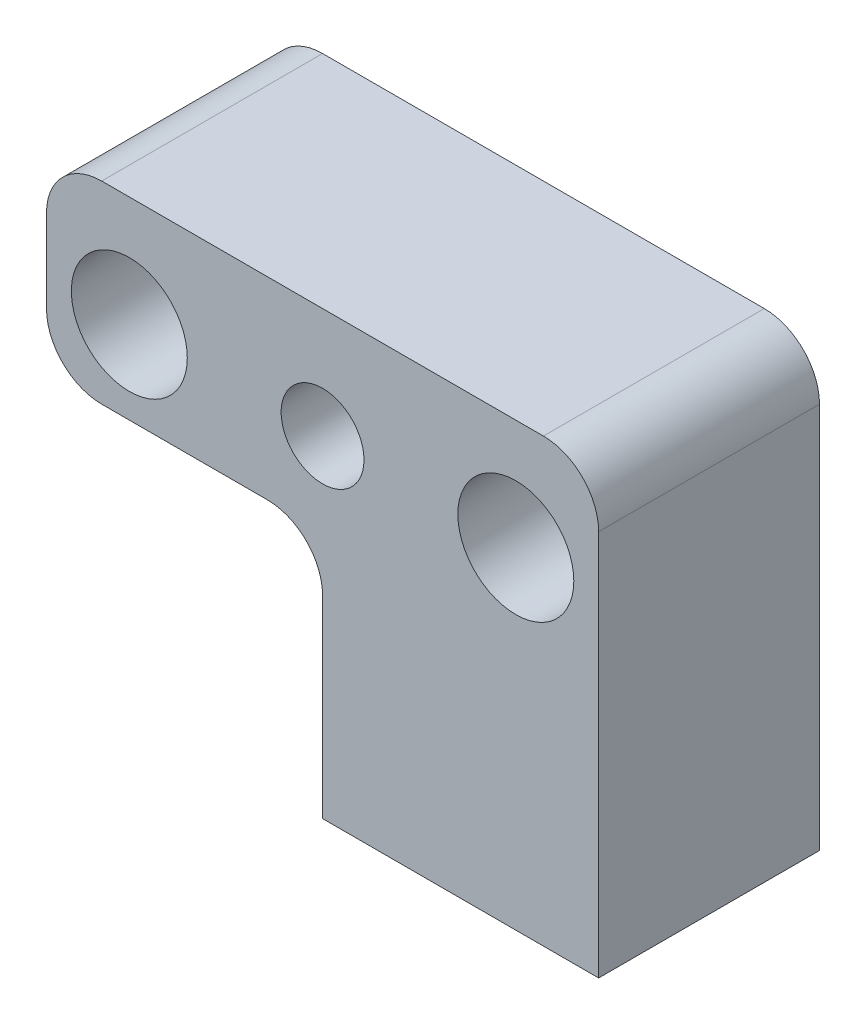
ISO-10303-21;
HEADER;
FILE_DESCRIPTION(('STEP AP214'),'2;1');
FILE_NAME('part.step','',(''),(''),'','','');
FILE_SCHEMA(('AUTOMOTIVE_DESIGN { 1 0 10303 214 1 1 1 1 }'));
ENDSEC;
DATA;
#1=APPLICATION_CONTEXT('core data for automotive mechanical design processes');
#2=APPLICATION_PROTOCOL_DEFINITION('international standard','automotive_design',2000,#1);
#3=PRODUCT_CONTEXT('',#1,'mechanical');
#4=PRODUCT('Part','Part','',(#3));
#5=PRODUCT_RELATED_PRODUCT_CATEGORY('part','',(#4));
#6=PRODUCT_DEFINITION_FORMATION('','',#4);
#7=PRODUCT_DEFINITION_CONTEXT('part definition',#1,'design');
#8=PRODUCT_DEFINITION('design','',#6,#7);
#9=PRODUCT_DEFINITION_SHAPE('','',#8);
#10=(LENGTH_UNIT() NAMED_UNIT(*) SI_UNIT(.MILLI.,.METRE.));
#11=(NAMED_UNIT(*) PLANE_ANGLE_UNIT() SI_UNIT($,.RADIAN.));
#12=(NAMED_UNIT(*) SI_UNIT($,.STERADIAN.) SOLID_ANGLE_UNIT());
#13=UNCERTAINTY_MEASURE_WITH_UNIT(LENGTH_MEASURE(1.E-05),#10,'distance_accuracy_value','');
#14=(GEOMETRIC_REPRESENTATION_CONTEXT(3) GLOBAL_UNCERTAINTY_ASSIGNED_CONTEXT((#13)) GLOBAL_UNIT_ASSIGNED_CONTEXT((#10,
#11,#12)) REPRESENTATION_CONTEXT('',''));
#15=CARTESIAN_POINT('',(0.,0.,0.));
#16=DIRECTION('',(0.,0.,1.));
#17=DIRECTION('',(1.,0.,0.));
#18=AXIS2_PLACEMENT_3D('',#15,#16,#17);
#19=CARTESIAN_POINT('',(40.,9.99999999999999,-0.001000000000001));
#20=DIRECTION('',(0.,0.,-1.));
#21=DIRECTION('',(-1.,0.,0.));
#22=AXIS2_PLACEMENT_3D('',#19,#20,#21);
#23=CYLINDRICAL_SURFACE('',#22,10.);
#24=DIRECTION('',(0.,0.,-1.));
#25=VECTOR('',#24,1.);
#26=CARTESIAN_POINT('',(40.,20.,-0.001000000000001));
#27=LINE('',#26,#25);
#28=CARTESIAN_POINT('',(40.,20.,40.));
#29=VERTEX_POINT('',#28);
#30=CARTESIAN_POINT('',(40.,20.,0.));
#31=VERTEX_POINT('',#30);
#32=EDGE_CURVE('E213',#29,#31,#27,.T.);
#33=ORIENTED_EDGE('',*,*,#32,.F.);
#34=CARTESIAN_POINT('',(40.,9.99999999999999,40.));
#35=DIRECTION('',(0.,0.,1.));
#36=DIRECTION('',(1.,0.,0.));
#37=AXIS2_PLACEMENT_3D('',#34,#35,#36);
#38=CIRCLE('',#37,10.);
#39=CARTESIAN_POINT('',(50.,9.99999999999999,40.));
#40=VERTEX_POINT('',#39);
#41=EDGE_CURVE('E43',#40,#29,#38,.T.);
#42=ORIENTED_EDGE('',*,*,#41,.F.);
#43=DIRECTION('',(0.,0.,-1.));
#44=VECTOR('',#43,1.);
#45=CARTESIAN_POINT('',(50.,9.99999999999999,40.));
#46=LINE('',#45,#44);
#47=CARTESIAN_POINT('',(50.,9.99999999999999,0.));
#48=VERTEX_POINT('',#47);
#49=EDGE_CURVE('E216',#48,#40,#46,.F.);
#50=ORIENTED_EDGE('',*,*,#49,.F.);
#51=CARTESIAN_POINT('',(40.,9.99999999999999,0.));
#52=DIRECTION('',(0.,0.,1.));
#53=DIRECTION('',(1.,0.,0.));
#54=AXIS2_PLACEMENT_3D('',#51,#52,#53);
#55=CIRCLE('',#54,10.);
#56=EDGE_CURVE('E11',#31,#48,#55,.F.);
#57=ORIENTED_EDGE('',*,*,#56,.F.);
#58=EDGE_LOOP('',(#33,#42,#50,#57));
#59=FACE_BOUND('',#58,.T.);
#60=ADVANCED_FACE('F36',(#59),#23,.T.);
#61=CARTESIAN_POINT('',(-40.,9.99999999999999,40.));
#62=DIRECTION('',(0.,0.,-1.));
#63=DIRECTION('',(-1.,0.,0.));
#64=AXIS2_PLACEMENT_3D('',#61,#62,#63);
#65=CYLINDRICAL_SURFACE('',#64,10.);
#66=DIRECTION('',(0.,0.,-1.));
#67=VECTOR('',#66,1.);
#68=CARTESIAN_POINT('',(-50.,9.99999999999999,40.));
#69=LINE('',#68,#67);
#70=CARTESIAN_POINT('',(-50.,9.99999999999999,40.));
#71=VERTEX_POINT('',#70);
#72=CARTESIAN_POINT('',(-50.,9.99999999999999,0.));
#73=VERTEX_POINT('',#72);
#74=EDGE_CURVE('E202',#71,#73,#69,.T.);
#75=ORIENTED_EDGE('',*,*,#74,.F.);
#76=CARTESIAN_POINT('',(-40.,9.99999999999999,40.));
#77=DIRECTION('',(0.,0.,1.));
#78=DIRECTION('',(1.,0.,0.));
#79=AXIS2_PLACEMENT_3D('',#76,#77,#78);
#80=CIRCLE('',#79,10.);
#81=CARTESIAN_POINT('',(-40.,20.,40.));
#82=VERTEX_POINT('',#81);
#83=EDGE_CURVE('E208',#82,#71,#80,.T.);
#84=ORIENTED_EDGE('',*,*,#83,.F.);
#85=DIRECTION('',(0.,0.,-1.));
#86=VECTOR('',#85,1.);
#87=CARTESIAN_POINT('',(-40.,20.,-0.001000000000001));
#88=LINE('',#87,#86);
#89=CARTESIAN_POINT('',(-40.,20.,0.));
#90=VERTEX_POINT('',#89);
#91=EDGE_CURVE('E205',#90,#82,#88,.F.);
#92=ORIENTED_EDGE('',*,*,#91,.F.);
#93=CARTESIAN_POINT('',(-40.,9.99999999999999,0.));
#94=DIRECTION('',(0.,0.,1.));
#95=DIRECTION('',(1.,0.,0.));
#96=AXIS2_PLACEMENT_3D('',#93,#94,#95);
#97=CIRCLE('',#96,10.);
#98=EDGE_CURVE('E210',#73,#90,#97,.F.);
#99=ORIENTED_EDGE('',*,*,#98,.F.);
#100=EDGE_LOOP('',(#75,#84,#92,#99));
#101=FACE_BOUND('',#100,.T.);
#102=ADVANCED_FACE('F226',(#101),#65,.T.);
#103=CARTESIAN_POINT('',(-40.,-5.00000000000001,40.001));
#104=DIRECTION('',(0.,0.,-1.));
#105=DIRECTION('',(-1.,0.,0.));
#106=AXIS2_PLACEMENT_3D('',#103,#104,#105);
#107=CYLINDRICAL_SURFACE('',#106,10.);
#108=DIRECTION('',(0.,0.,-1.));
#109=VECTOR('',#108,1.);
#110=CARTESIAN_POINT('',(-40.,-15.,40.001));
#111=LINE('',#110,#109);
#112=CARTESIAN_POINT('',(-40.,-15.,40.));
#113=VERTEX_POINT('',#112);
#114=CARTESIAN_POINT('',(-40.,-15.,0.));
#115=VERTEX_POINT('',#114);
#116=EDGE_CURVE('E191',#113,#115,#111,.T.);
#117=ORIENTED_EDGE('',*,*,#116,.F.);
#118=CARTESIAN_POINT('',(-40.,-5.00000000000001,40.));
#119=DIRECTION('',(0.,0.,1.));
#120=DIRECTION('',(1.,0.,0.));
#121=AXIS2_PLACEMENT_3D('',#118,#119,#120);
#122=CIRCLE('',#121,10.);
#123=CARTESIAN_POINT('',(-50.,-5.,40.));
#124=VERTEX_POINT('',#123);
#125=EDGE_CURVE('E197',#124,#113,#122,.T.);
#126=ORIENTED_EDGE('',*,*,#125,.F.);
#127=DIRECTION('',(0.,0.,-1.));
#128=VECTOR('',#127,1.);
#129=CARTESIAN_POINT('',(-50.,-5.,40.));
#130=LINE('',#129,#128);
#131=CARTESIAN_POINT('',(-50.,-5.,0.));
#132=VERTEX_POINT('',#131);
#133=EDGE_CURVE('E194',#132,#124,#130,.F.);
#134=ORIENTED_EDGE('',*,*,#133,.F.);
#135=CARTESIAN_POINT('',(-40.,-5.00000000000001,0.));
#136=DIRECTION('',(0.,0.,1.));
#137=DIRECTION('',(1.,0.,0.));
#138=AXIS2_PLACEMENT_3D('',#135,#136,#137);
#139=CIRCLE('',#138,10.);
#140=EDGE_CURVE('E199',#115,#132,#139,.F.);
#141=ORIENTED_EDGE('',*,*,#140,.F.);
#142=EDGE_LOOP('',(#117,#126,#134,#141));
#143=FACE_BOUND('',#142,.T.);
#144=ADVANCED_FACE('F233',(#143),#107,.T.);
#145=CARTESIAN_POINT('',(-10.,-25.,40.001));
#146=DIRECTION('',(0.,0.,-1.));
#147=DIRECTION('',(-1.,0.,0.));
#148=AXIS2_PLACEMENT_3D('',#145,#146,#147);
#149=CYLINDRICAL_SURFACE('',#148,10.);
#150=DIRECTION('',(0.,0.,1.));
#151=VECTOR('',#150,1.);
#152=CARTESIAN_POINT('',(-10.,-15.,40.001));
#153=LINE('',#152,#151);
#154=CARTESIAN_POINT('',(-10.,-15.,0.));
#155=VERTEX_POINT('',#154);
#156=CARTESIAN_POINT('',(-10.,-15.,40.));
#157=VERTEX_POINT('',#156);
#158=EDGE_CURVE('E180',#155,#157,#153,.T.);
#159=ORIENTED_EDGE('',*,*,#158,.F.);
#160=CARTESIAN_POINT('',(-10.,-25.,0.));
#161=DIRECTION('',(0.,0.,1.));
#162=DIRECTION('',(1.,0.,0.));
#163=AXIS2_PLACEMENT_3D('',#160,#161,#162);
#164=CIRCLE('',#163,10.);
#165=CARTESIAN_POINT('',(0.,-25.,0.));
#166=VERTEX_POINT('',#165);
#167=EDGE_CURVE('E186',#155,#166,#164,.F.);
#168=ORIENTED_EDGE('',*,*,#167,.T.);
#169=DIRECTION('',(0.,0.,1.));
#170=VECTOR('',#169,1.);
#171=CARTESIAN_POINT('',(0.,-25.,40.001));
#172=LINE('',#171,#170);
#173=CARTESIAN_POINT('',(0.,-25.,40.));
#174=VERTEX_POINT('',#173);
#175=EDGE_CURVE('E117',#174,#166,#172,.F.);
#176=ORIENTED_EDGE('',*,*,#175,.F.);
#177=CARTESIAN_POINT('',(-10.,-25.,40.));
#178=DIRECTION('',(0.,0.,1.));
#179=DIRECTION('',(1.,0.,0.));
#180=AXIS2_PLACEMENT_3D('',#177,#178,#179);
#181=CIRCLE('',#180,10.);
#182=EDGE_CURVE('E188',#174,#157,#181,.T.);
#183=ORIENTED_EDGE('',*,*,#182,.T.);
#184=EDGE_LOOP('',(#159,#168,#176,#183));
#185=FACE_BOUND('',#184,.T.);
#186=ADVANCED_FACE('F242',(#185),#149,.F.);
#187=CARTESIAN_POINT('',(-50.,-40.,40.));
#188=DIRECTION('',(1.,0.,0.));
#189=DIRECTION('',(0.,0.,-1.));
#190=AXIS2_PLACEMENT_3D('',#187,#188,#189);
#191=PLANE('',#190);
#192=DIRECTION('',(0.,-1.,0.));
#193=VECTOR('',#192,1.);
#194=CARTESIAN_POINT('',(-50.,-40.,40.));
#195=LINE('',#194,#193);
#196=EDGE_CURVE('E175',#71,#124,#195,.T.);
#197=ORIENTED_EDGE('',*,*,#196,.F.);
#198=ORIENTED_EDGE('',*,*,#74,.T.);
#199=DIRECTION('',(0.,-1.,0.));
#200=VECTOR('',#199,1.);
#201=CARTESIAN_POINT('',(-50.,-40.,0.));
#202=LINE('',#201,#200);
#203=EDGE_CURVE('E174',#73,#132,#202,.T.);
#204=ORIENTED_EDGE('',*,*,#203,.T.);
#205=ORIENTED_EDGE('',*,*,#133,.T.);
#206=EDGE_LOOP('',(#197,#198,#204,#205));
#207=FACE_BOUND('',#206,.T.);
#208=ADVANCED_FACE('F235',(#207),#191,.F.);
#209=CARTESIAN_POINT('',(50.,-40.,40.));
#210=DIRECTION('',(-1.,0.,0.));
#211=DIRECTION('',(0.,0.,1.));
#212=AXIS2_PLACEMENT_3D('',#209,#210,#211);
#213=PLANE('',#212);
#214=DIRECTION('',(0.,1.,0.));
#215=VECTOR('',#214,1.);
#216=CARTESIAN_POINT('',(50.,-40.,0.));
#217=LINE('',#216,#215);
#218=CARTESIAN_POINT('',(50.,-60.,0.));
#219=VERTEX_POINT('',#218);
#220=EDGE_CURVE('E126',#219,#48,#217,.T.);
#221=ORIENTED_EDGE('',*,*,#220,.T.);
#222=ORIENTED_EDGE('',*,*,#49,.T.);
#223=DIRECTION('',(0.,1.,0.));
#224=VECTOR('',#223,1.);
#225=CARTESIAN_POINT('',(50.,-40.,40.));
#226=LINE('',#225,#224);
#227=CARTESIAN_POINT('',(50.,-60.,40.));
#228=VERTEX_POINT('',#227);
#229=EDGE_CURVE('E177',#228,#40,#226,.T.);
#230=ORIENTED_EDGE('',*,*,#229,.F.);
#231=DIRECTION('',(0.,0.,1.));
#232=VECTOR('',#231,1.);
#233=CARTESIAN_POINT('',(50.,-60.,40.));
#234=LINE('',#233,#232);
#235=EDGE_CURVE('E130',#219,#228,#234,.T.);
#236=ORIENTED_EDGE('',*,*,#235,.F.);
#237=EDGE_LOOP('',(#221,#222,#230,#236));
#238=FACE_BOUND('',#237,.T.);
#239=ADVANCED_FACE('F249',(#238),#213,.F.);
#240=CARTESIAN_POINT('',(0.,0.,40.));
#241=DIRECTION('',(0.,0.,1.));
#242=DIRECTION('',(1.,0.,0.));
#243=AXIS2_PLACEMENT_3D('',#240,#241,#242);
#244=PLANE('',#243);
#245=ORIENTED_EDGE('',*,*,#229,.T.);
#246=ORIENTED_EDGE('',*,*,#41,.T.);
#247=DIRECTION('',(1.,0.,0.));
#248=VECTOR('',#247,1.);
#249=CARTESIAN_POINT('',(-50.,20.,40.));
#250=LINE('',#249,#248);
#251=EDGE_CURVE('E151',#82,#29,#250,.T.);
#252=ORIENTED_EDGE('',*,*,#251,.F.);
#253=ORIENTED_EDGE('',*,*,#83,.T.);
#254=ORIENTED_EDGE('',*,*,#196,.T.);
#255=ORIENTED_EDGE('',*,*,#125,.T.);
#256=DIRECTION('',(1.,0.,0.));
#257=VECTOR('',#256,1.);
#258=CARTESIAN_POINT('',(-50.,-15.,40.));
#259=LINE('',#258,#257);
#260=EDGE_CURVE('E119',#113,#157,#259,.T.);
#261=ORIENTED_EDGE('',*,*,#260,.T.);
#262=ORIENTED_EDGE('',*,*,#182,.F.);
#263=DIRECTION('',(0.,-1.,0.));
#264=VECTOR('',#263,1.);
#265=CARTESIAN_POINT('',(0.,-40.,40.));
#266=LINE('',#265,#264);
#267=CARTESIAN_POINT('',(0.,-60.,40.));
#268=VERTEX_POINT('',#267);
#269=EDGE_CURVE('E147',#174,#268,#266,.T.);
#270=ORIENTED_EDGE('',*,*,#269,.T.);
#271=DIRECTION('',(-1.,0.,0.));
#272=VECTOR('',#271,1.);
#273=CARTESIAN_POINT('',(0.,-60.,40.));
#274=LINE('',#273,#272);
#275=EDGE_CURVE('E135',#228,#268,#274,.T.);
#276=ORIENTED_EDGE('',*,*,#275,.F.);
#277=EDGE_LOOP('',(#245,#246,#252,#253,#254,#255,#261,#262,#270,#276));
#278=FACE_BOUND('',#277,.T.);
#279=CARTESIAN_POINT('',(35.,0.,40.));
#280=DIRECTION('',(0.,0.,1.));
#281=DIRECTION('',(-1.,0.,0.));
#282=AXIS2_PLACEMENT_3D('',#279,#280,#281);
#283=CIRCLE('',#282,10.5);
#284=CARTESIAN_POINT('',(24.5,0.,40.));
#285=VERTEX_POINT('',#284);
#286=EDGE_CURVE('E156',#285,#285,#283,.T.);
#287=ORIENTED_EDGE('',*,*,#286,.F.);
#288=EDGE_LOOP('',(#287));
#289=FACE_BOUND('',#288,.T.);
#290=CARTESIAN_POINT('',(-35.,0.,40.));
#291=DIRECTION('',(0.,0.,1.));
#292=DIRECTION('',(1.,0.,0.));
#293=AXIS2_PLACEMENT_3D('',#290,#291,#292);
#294=CIRCLE('',#293,10.5);
#295=CARTESIAN_POINT('',(-24.5,0.,40.));
#296=VERTEX_POINT('',#295);
#297=EDGE_CURVE('E157',#296,#296,#294,.T.);
#298=ORIENTED_EDGE('',*,*,#297,.F.);
#299=EDGE_LOOP('',(#298));
#300=FACE_BOUND('',#299,.T.);
#301=CARTESIAN_POINT('',(0.,0.,40.));
#302=DIRECTION('',(0.,0.,1.));
#303=DIRECTION('',(1.,0.,0.));
#304=AXIS2_PLACEMENT_3D('',#301,#302,#303);
#305=CIRCLE('',#304,7.5);
#306=CARTESIAN_POINT('',(7.5,0.,40.));
#307=VERTEX_POINT('',#306);
#308=EDGE_CURVE('E164',#307,#307,#305,.T.);
#309=ORIENTED_EDGE('',*,*,#308,.F.);
#310=EDGE_LOOP('',(#309));
#311=FACE_BOUND('',#310,.T.);
#312=ADVANCED_FACE('F219',(#278,#289,#300,#311),#244,.T.);
#313=CARTESIAN_POINT('',(0.,0.,0.));
#314=DIRECTION('',(0.,0.,1.));
#315=DIRECTION('',(1.,0.,0.));
#316=AXIS2_PLACEMENT_3D('',#313,#314,#315);
#317=PLANE('',#316);
#318=CARTESIAN_POINT('',(35.,0.,0.));
#319=DIRECTION('',(0.,0.,1.));
#320=DIRECTION('',(1.,0.,0.));
#321=AXIS2_PLACEMENT_3D('',#318,#319,#320);
#322=CIRCLE('',#321,10.5);
#323=CARTESIAN_POINT('',(45.5,0.,0.));
#324=VERTEX_POINT('',#323);
#325=EDGE_CURVE('E161',#324,#324,#322,.F.);
#326=ORIENTED_EDGE('',*,*,#325,.F.);
#327=EDGE_LOOP('',(#326));
#328=FACE_BOUND('',#327,.T.);
#329=CARTESIAN_POINT('',(-35.,0.,0.));
#330=DIRECTION('',(0.,0.,1.));
#331=DIRECTION('',(1.,0.,0.));
#332=AXIS2_PLACEMENT_3D('',#329,#330,#331);
#333=CIRCLE('',#332,10.5);
#334=CARTESIAN_POINT('',(-24.5,0.,0.));
#335=VERTEX_POINT('',#334);
#336=EDGE_CURVE('E160',#335,#335,#333,.F.);
#337=ORIENTED_EDGE('',*,*,#336,.F.);
#338=EDGE_LOOP('',(#337));
#339=FACE_BOUND('',#338,.T.);
#340=CARTESIAN_POINT('',(0.,0.,0.));
#341=DIRECTION('',(0.,0.,1.));
#342=DIRECTION('',(1.,0.,0.));
#343=AXIS2_PLACEMENT_3D('',#340,#341,#342);
#344=CIRCLE('',#343,7.5);
#345=CARTESIAN_POINT('',(7.5,0.,0.));
#346=VERTEX_POINT('',#345);
#347=EDGE_CURVE('E171',#346,#346,#344,.F.);
#348=ORIENTED_EDGE('',*,*,#347,.F.);
#349=EDGE_LOOP('',(#348));
#350=FACE_BOUND('',#349,.T.);
#351=DIRECTION('',(-1.,0.,0.));
#352=VECTOR('',#351,1.);
#353=CARTESIAN_POINT('',(-50.,20.,0.));
#354=LINE('',#353,#352);
#355=EDGE_CURVE('E154',#31,#90,#354,.T.);
#356=ORIENTED_EDGE('',*,*,#355,.F.);
#357=ORIENTED_EDGE('',*,*,#56,.T.);
#358=ORIENTED_EDGE('',*,*,#220,.F.);
#359=DIRECTION('',(1.,0.,0.));
#360=VECTOR('',#359,1.);
#361=CARTESIAN_POINT('',(0.,-60.,0.));
#362=LINE('',#361,#360);
#363=CARTESIAN_POINT('',(0.,-60.,0.));
#364=VERTEX_POINT('',#363);
#365=EDGE_CURVE('E123',#364,#219,#362,.T.);
#366=ORIENTED_EDGE('',*,*,#365,.F.);
#367=DIRECTION('',(0.,-1.,0.));
#368=VECTOR('',#367,1.);
#369=CARTESIAN_POINT('',(0.,-40.,0.));
#370=LINE('',#369,#368);
#371=EDGE_CURVE('E110',#166,#364,#370,.T.);
#372=ORIENTED_EDGE('',*,*,#371,.F.);
#373=ORIENTED_EDGE('',*,*,#167,.F.);
#374=DIRECTION('',(1.,0.,0.));
#375=VECTOR('',#374,1.);
#376=CARTESIAN_POINT('',(-50.,-15.,0.));
#377=LINE('',#376,#375);
#378=EDGE_CURVE('E120',#115,#155,#377,.T.);
#379=ORIENTED_EDGE('',*,*,#378,.F.);
#380=ORIENTED_EDGE('',*,*,#140,.T.);
#381=ORIENTED_EDGE('',*,*,#203,.F.);
#382=ORIENTED_EDGE('',*,*,#98,.T.);
#383=EDGE_LOOP('',(#356,#357,#358,#366,#372,#373,#379,#380,#381,#382));
#384=FACE_BOUND('',#383,.T.);
#385=ADVANCED_FACE('F124',(#328,#339,#350,#384),#317,.F.);
#386=CARTESIAN_POINT('',(0.,0.,-0.001000000000001));
#387=DIRECTION('',(0.,0.,1.));
#388=DIRECTION('',(1.,0.,0.));
#389=AXIS2_PLACEMENT_3D('',#386,#387,#388);
#390=CYLINDRICAL_SURFACE('',#389,7.5);
#391=ORIENTED_EDGE('',*,*,#308,.T.);
#392=EDGE_LOOP('',(#391));
#393=FACE_BOUND('',#392,.T.);
#394=ORIENTED_EDGE('',*,*,#347,.T.);
#395=EDGE_LOOP('',(#394));
#396=FACE_BOUND('',#395,.T.);
#397=ADVANCED_FACE('F347',(#393,#396),#390,.F.);
#398=CARTESIAN_POINT('',(-35.,0.,-0.001000000000001));
#399=DIRECTION('',(0.,0.,1.));
#400=DIRECTION('',(1.,0.,0.));
#401=AXIS2_PLACEMENT_3D('',#398,#399,#400);
#402=CYLINDRICAL_SURFACE('',#401,10.5);
#403=ORIENTED_EDGE('',*,*,#297,.T.);
#404=EDGE_LOOP('',(#403));
#405=FACE_BOUND('',#404,.T.);
#406=ORIENTED_EDGE('',*,*,#336,.T.);
#407=EDGE_LOOP('',(#406));
#408=FACE_BOUND('',#407,.T.);
#409=ADVANCED_FACE('F393',(#405,#408),#402,.F.);
#410=CARTESIAN_POINT('',(35.,0.,-0.001000000000001));
#411=DIRECTION('',(0.,0.,1.));
#412=DIRECTION('',(1.,0.,0.));
#413=AXIS2_PLACEMENT_3D('',#410,#411,#412);
#414=CYLINDRICAL_SURFACE('',#413,10.5);
#415=ORIENTED_EDGE('',*,*,#286,.T.);
#416=EDGE_LOOP('',(#415));
#417=FACE_BOUND('',#416,.T.);
#418=ORIENTED_EDGE('',*,*,#325,.T.);
#419=EDGE_LOOP('',(#418));
#420=FACE_BOUND('',#419,.T.);
#421=ADVANCED_FACE('F384',(#417,#420),#414,.F.);
#422=CARTESIAN_POINT('',(-50.,20.,-0.001000000000001));
#423=DIRECTION('',(0.,-1.,0.));
#424=DIRECTION('',(1.,0.,0.));
#425=AXIS2_PLACEMENT_3D('',#422,#423,#424);
#426=PLANE('',#425);
#427=ORIENTED_EDGE('',*,*,#251,.T.);
#428=ORIENTED_EDGE('',*,*,#32,.T.);
#429=ORIENTED_EDGE('',*,*,#355,.T.);
#430=ORIENTED_EDGE('',*,*,#91,.T.);
#431=EDGE_LOOP('',(#427,#428,#429,#430));
#432=FACE_BOUND('',#431,.T.);
#433=ADVANCED_FACE('F222',(#432),#426,.F.);
#434=CARTESIAN_POINT('',(0.,-40.,40.001));
#435=DIRECTION('',(1.,0.,0.));
#436=DIRECTION('',(0.,0.,-1.));
#437=AXIS2_PLACEMENT_3D('',#434,#435,#436);
#438=PLANE('',#437);
#439=ORIENTED_EDGE('',*,*,#269,.F.);
#440=ORIENTED_EDGE('',*,*,#175,.T.);
#441=ORIENTED_EDGE('',*,*,#371,.T.);
#442=DIRECTION('',(0.,0.,-1.));
#443=VECTOR('',#442,1.);
#444=CARTESIAN_POINT('',(0.,-60.,40.));
#445=LINE('',#444,#443);
#446=EDGE_CURVE('E115',#268,#364,#445,.T.);
#447=ORIENTED_EDGE('',*,*,#446,.F.);
#448=EDGE_LOOP('',(#439,#440,#441,#447));
#449=FACE_BOUND('',#448,.T.);
#450=ADVANCED_FACE('F113',(#449),#438,.F.);
#451=CARTESIAN_POINT('',(-50.,-15.,40.001));
#452=DIRECTION('',(0.,1.,0.));
#453=DIRECTION('',(-1.,0.,0.));
#454=AXIS2_PLACEMENT_3D('',#451,#452,#453);
#455=PLANE('',#454);
#456=ORIENTED_EDGE('',*,*,#260,.F.);
#457=ORIENTED_EDGE('',*,*,#116,.T.);
#458=ORIENTED_EDGE('',*,*,#378,.T.);
#459=ORIENTED_EDGE('',*,*,#158,.T.);
#460=EDGE_LOOP('',(#456,#457,#458,#459));
#461=FACE_BOUND('',#460,.T.);
#462=ADVANCED_FACE('F239',(#461),#455,.F.);
#463=CARTESIAN_POINT('',(0.,-60.,0.));
#464=DIRECTION('',(0.,-1.,0.));
#465=DIRECTION('',(1.,0.,0.));
#466=AXIS2_PLACEMENT_3D('',#463,#464,#465);
#467=PLANE('',#466);
#468=CARTESIAN_POINT('',(16.,-60.,20.));
#469=DIRECTION('',(0.,-1.,0.));
#470=DIRECTION('',(-1.,0.,0.));
#471=AXIS2_PLACEMENT_3D('',#468,#469,#470);
#472=CIRCLE('',#471,3.);
#473=CARTESIAN_POINT('',(13.,-60.,20.));
#474=VERTEX_POINT('',#473);
#475=EDGE_CURVE('E139',#474,#474,#472,.T.);
#476=ORIENTED_EDGE('',*,*,#475,.F.);
#477=EDGE_LOOP('',(#476));
#478=FACE_BOUND('',#477,.T.);
#479=CARTESIAN_POINT('',(36.,-60.,20.));
#480=DIRECTION('',(0.,-1.,0.));
#481=DIRECTION('',(-1.,0.,0.));
#482=AXIS2_PLACEMENT_3D('',#479,#480,#481);
#483=CIRCLE('',#482,3.);
#484=CARTESIAN_POINT('',(33.,-60.,20.));
#485=VERTEX_POINT('',#484);
#486=EDGE_CURVE('E142',#485,#485,#483,.T.);
#487=ORIENTED_EDGE('',*,*,#486,.F.);
#488=EDGE_LOOP('',(#487));
#489=FACE_BOUND('',#488,.T.);
#490=ORIENTED_EDGE('',*,*,#446,.T.);
#491=ORIENTED_EDGE('',*,*,#365,.T.);
#492=ORIENTED_EDGE('',*,*,#235,.T.);
#493=ORIENTED_EDGE('',*,*,#275,.T.);
#494=EDGE_LOOP('',(#490,#491,#492,#493));
#495=FACE_BOUND('',#494,.T.);
#496=ADVANCED_FACE('F133',(#478,#489,#495),#467,.T.);
#497=CARTESIAN_POINT('',(36.,-20.,20.));
#498=DIRECTION('',(0.,-1.,0.));
#499=DIRECTION('',(1.,0.,0.));
#500=AXIS2_PLACEMENT_3D('',#497,#498,#499);
#501=CYLINDRICAL_SURFACE('',#500,3.);
#502=CARTESIAN_POINT('',(36.,-20.,20.));
#503=DIRECTION('',(0.,-1.,0.));
#504=DIRECTION('',(-1.,0.,0.));
#505=AXIS2_PLACEMENT_3D('',#502,#503,#504);
#506=CIRCLE('',#505,3.);
#507=CARTESIAN_POINT('',(33.,-20.,20.));
#508=VERTEX_POINT('',#507);
#509=EDGE_CURVE('E438',#508,#508,#506,.T.);
#510=ORIENTED_EDGE('',*,*,#509,.F.);
#511=EDGE_LOOP('',(#510));
#512=FACE_BOUND('',#511,.T.);
#513=ORIENTED_EDGE('',*,*,#486,.T.);
#514=EDGE_LOOP('',(#513));
#515=FACE_BOUND('',#514,.T.);
#516=ADVANCED_FACE('F287',(#512,#515),#501,.F.);
#517=CARTESIAN_POINT('',(36.,-20.,20.));
#518=DIRECTION('',(0.,1.,0.));
#519=DIRECTION('',(-1.,0.,0.));
#520=AXIS2_PLACEMENT_3D('',#517,#518,#519);
#521=PLANE('',#520);
#522=ORIENTED_EDGE('',*,*,#509,.T.);
#523=EDGE_LOOP('',(#522));
#524=FACE_BOUND('',#523,.T.);
#525=ADVANCED_FACE('F295',(#524),#521,.F.);
#526=CARTESIAN_POINT('',(16.,-20.,20.));
#527=DIRECTION('',(0.,-1.,0.));
#528=DIRECTION('',(1.,0.,0.));
#529=AXIS2_PLACEMENT_3D('',#526,#527,#528);
#530=CYLINDRICAL_SURFACE('',#529,3.);
#531=CARTESIAN_POINT('',(16.,-20.,20.));
#532=DIRECTION('',(0.,-1.,0.));
#533=DIRECTION('',(-1.,0.,0.));
#534=AXIS2_PLACEMENT_3D('',#531,#532,#533);
#535=CIRCLE('',#534,3.);
#536=CARTESIAN_POINT('',(13.,-20.,20.));
#537=VERTEX_POINT('',#536);
#538=EDGE_CURVE('E136',#537,#537,#535,.T.);
#539=ORIENTED_EDGE('',*,*,#538,.F.);
#540=EDGE_LOOP('',(#539));
#541=FACE_BOUND('',#540,.T.);
#542=ORIENTED_EDGE('',*,*,#475,.T.);
#543=EDGE_LOOP('',(#542));
#544=FACE_BOUND('',#543,.T.);
#545=ADVANCED_FACE('F303',(#541,#544),#530,.F.);
#546=CARTESIAN_POINT('',(16.,-20.,20.));
#547=DIRECTION('',(0.,1.,0.));
#548=DIRECTION('',(-1.,0.,0.));
#549=AXIS2_PLACEMENT_3D('',#546,#547,#548);
#550=PLANE('',#549);
#551=ORIENTED_EDGE('',*,*,#538,.T.);
#552=EDGE_LOOP('',(#551));
#553=FACE_BOUND('',#552,.T.);
#554=ADVANCED_FACE('F311',(#553),#550,.F.);
#555=CLOSED_SHELL('',(#60,#102,#144,#186,#208,#239,#312,#385,#397,#409,#421,#433,#450,#462,#496,
#516,#525,#545,#554));
#556=MANIFOLD_SOLID_BREP('B2',#555);
#557=ADVANCED_BREP_SHAPE_REPRESENTATION('',(#18,#556),#14);
#558=SHAPE_DEFINITION_REPRESENTATION(#9,#557);
ENDSEC;
END-ISO-10303-21;
